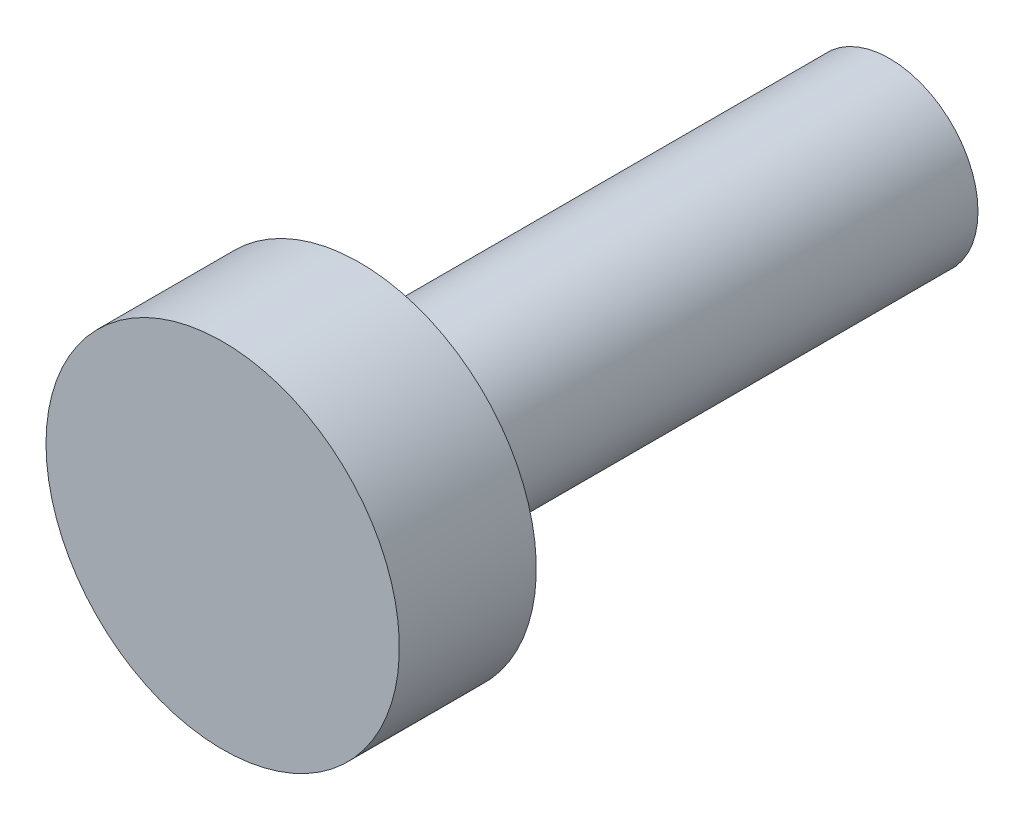
ISO-10303-21;
HEADER;
FILE_DESCRIPTION(('STEP AP214'),'2;1');
FILE_NAME('part.step','',(''),(''),'','','');
FILE_SCHEMA(('AUTOMOTIVE_DESIGN { 1 0 10303 214 1 1 1 1 }'));
ENDSEC;
DATA;
#1=APPLICATION_CONTEXT('core data for automotive mechanical design processes');
#2=APPLICATION_PROTOCOL_DEFINITION('international standard','automotive_design',2000,#1);
#3=PRODUCT_CONTEXT('',#1,'mechanical');
#4=PRODUCT('Part','Part','',(#3));
#5=PRODUCT_RELATED_PRODUCT_CATEGORY('part','',(#4));
#6=PRODUCT_DEFINITION_FORMATION('','',#4);
#7=PRODUCT_DEFINITION_CONTEXT('part definition',#1,'design');
#8=PRODUCT_DEFINITION('design','',#6,#7);
#9=PRODUCT_DEFINITION_SHAPE('','',#8);
#10=(LENGTH_UNIT() NAMED_UNIT(*) SI_UNIT(.MILLI.,.METRE.));
#11=(NAMED_UNIT(*) PLANE_ANGLE_UNIT() SI_UNIT($,.RADIAN.));
#12=(NAMED_UNIT(*) SI_UNIT($,.STERADIAN.) SOLID_ANGLE_UNIT());
#13=UNCERTAINTY_MEASURE_WITH_UNIT(LENGTH_MEASURE(1.E-05),#10,'distance_accuracy_value','');
#14=(GEOMETRIC_REPRESENTATION_CONTEXT(3) GLOBAL_UNCERTAINTY_ASSIGNED_CONTEXT((#13)) GLOBAL_UNIT_ASSIGNED_CONTEXT((#10,
#11,#12)) REPRESENTATION_CONTEXT('',''));
#15=CARTESIAN_POINT('',(0.,0.,0.));
#16=DIRECTION('',(0.,0.,1.));
#17=DIRECTION('',(1.,0.,0.));
#18=AXIS2_PLACEMENT_3D('',#15,#16,#17);
#19=CARTESIAN_POINT('',(0.,0.,3.1));
#20=DIRECTION('',(0.,0.,-1.));
#21=DIRECTION('',(-1.,0.,0.));
#22=AXIS2_PLACEMENT_3D('',#19,#20,#21);
#23=CYLINDRICAL_SURFACE('',#22,4.);
#24=CARTESIAN_POINT('',(0.,0.,3.1));
#25=DIRECTION('',(0.,0.,1.));
#26=DIRECTION('',(1.,0.,0.));
#27=AXIS2_PLACEMENT_3D('',#24,#25,#26);
#28=CIRCLE('',#27,4.);
#29=CARTESIAN_POINT('',(-4.,0.,3.1));
#30=VERTEX_POINT('',#29);
#31=EDGE_CURVE('E37',#30,#30,#28,.T.);
#32=CARTESIAN_POINT('',(0.,0.,0.));
#33=DIRECTION('',(0.,0.,1.));
#34=DIRECTION('',(1.,0.,0.));
#35=AXIS2_PLACEMENT_3D('',#32,#33,#34);
#36=CIRCLE('',#35,4.);
#37=CARTESIAN_POINT('',(-4.,0.,0.));
#38=VERTEX_POINT('',#37);
#39=EDGE_CURVE('E33',#38,#38,#36,.T.);
#40=CARTESIAN_POINT('',(-4.,0.,3.1));
#41=CARTESIAN_POINT('',(-4.,0.,3.06770833333333));
#42=CARTESIAN_POINT('',(-4.,0.,3.03541666666667));
#43=CARTESIAN_POINT('',(-4.,0.,2.97083333333333));
#44=CARTESIAN_POINT('',(-4.,0.,2.93854166666667));
#45=CARTESIAN_POINT('',(-4.,0.,2.87395833333333));
#46=CARTESIAN_POINT('',(-4.,0.,2.84166666666667));
#47=CARTESIAN_POINT('',(-4.,0.,2.77708333333333));
#48=CARTESIAN_POINT('',(-4.,0.,2.74479166666667));
#49=CARTESIAN_POINT('',(-4.,0.,2.68020833333333));
#50=CARTESIAN_POINT('',(-4.,0.,2.64791666666667));
#51=CARTESIAN_POINT('',(-4.,0.,2.58333333333333));
#52=CARTESIAN_POINT('',(-4.,0.,2.55104166666667));
#53=CARTESIAN_POINT('',(-4.,0.,2.48645833333333));
#54=CARTESIAN_POINT('',(-4.,0.,2.45416666666667));
#55=CARTESIAN_POINT('',(-4.,0.,2.38958333333333));
#56=CARTESIAN_POINT('',(-4.,0.,2.35729166666667));
#57=CARTESIAN_POINT('',(-4.,0.,2.29270833333333));
#58=CARTESIAN_POINT('',(-4.,0.,2.26041666666667));
#59=CARTESIAN_POINT('',(-4.,0.,2.19583333333333));
#60=CARTESIAN_POINT('',(-4.,0.,2.16354166666667));
#61=CARTESIAN_POINT('',(-4.,0.,2.09895833333333));
#62=CARTESIAN_POINT('',(-4.,0.,2.06666666666667));
#63=CARTESIAN_POINT('',(-4.,0.,2.00208333333333));
#64=CARTESIAN_POINT('',(-4.,0.,1.96979166666667));
#65=CARTESIAN_POINT('',(-4.,0.,1.90520833333333));
#66=CARTESIAN_POINT('',(-4.,0.,1.87291666666667));
#67=CARTESIAN_POINT('',(-4.,0.,1.80833333333333));
#68=CARTESIAN_POINT('',(-4.,0.,1.77604166666667));
#69=CARTESIAN_POINT('',(-4.,0.,1.71145833333333));
#70=CARTESIAN_POINT('',(-4.,0.,1.67916666666667));
#71=CARTESIAN_POINT('',(-4.,0.,1.61458333333333));
#72=CARTESIAN_POINT('',(-4.,0.,1.58229166666667));
#73=CARTESIAN_POINT('',(-4.,0.,1.51770833333333));
#74=CARTESIAN_POINT('',(-4.,0.,1.48541666666667));
#75=CARTESIAN_POINT('',(-4.,0.,1.42083333333333));
#76=CARTESIAN_POINT('',(-4.,0.,1.38854166666667));
#77=CARTESIAN_POINT('',(-4.,0.,1.32395833333333));
#78=CARTESIAN_POINT('',(-4.,0.,1.29166666666667));
#79=CARTESIAN_POINT('',(-4.,0.,1.22708333333333));
#80=CARTESIAN_POINT('',(-4.,0.,1.19479166666667));
#81=CARTESIAN_POINT('',(-4.,0.,1.13020833333333));
#82=CARTESIAN_POINT('',(-4.,0.,1.09791666666667));
#83=CARTESIAN_POINT('',(-4.,0.,1.03333333333333));
#84=CARTESIAN_POINT('',(-4.,0.,1.00104166666667));
#85=CARTESIAN_POINT('',(-4.,0.,0.936458333333333));
#86=CARTESIAN_POINT('',(-4.,0.,0.904166666666667));
#87=CARTESIAN_POINT('',(-4.,0.,0.839583333333333));
#88=CARTESIAN_POINT('',(-4.,0.,0.807291666666667));
#89=CARTESIAN_POINT('',(-4.,0.,0.742708333333333));
#90=CARTESIAN_POINT('',(-4.,0.,0.710416666666667));
#91=CARTESIAN_POINT('',(-4.,0.,0.645833333333333));
#92=CARTESIAN_POINT('',(-4.,0.,0.613541666666667));
#93=CARTESIAN_POINT('',(-4.,0.,0.548958333333333));
#94=CARTESIAN_POINT('',(-4.,0.,0.516666666666667));
#95=CARTESIAN_POINT('',(-4.,0.,0.452083333333333));
#96=CARTESIAN_POINT('',(-4.,0.,0.419791666666667));
#97=CARTESIAN_POINT('',(-4.,0.,0.355208333333333));
#98=CARTESIAN_POINT('',(-4.,0.,0.322916666666667));
#99=CARTESIAN_POINT('',(-4.,0.,0.258333333333333));
#100=CARTESIAN_POINT('',(-4.,0.,0.226041666666667));
#101=CARTESIAN_POINT('',(-4.,0.,0.161458333333333));
#102=CARTESIAN_POINT('',(-4.,0.,0.129166666666667));
#103=CARTESIAN_POINT('',(-4.,0.,0.0645833333333335));
#104=CARTESIAN_POINT('',(-4.,0.,0.0322916666666667));
#105=CARTESIAN_POINT('',(-4.,0.,0.));
#106=B_SPLINE_CURVE_WITH_KNOTS('',3,(#40,#41,#42,#43,#44,#45,#46,#47,#48,#49,#50,#51,#52,#53,
#54,#55,#56,#57,#58,#59,#60,#61,#62,#63,#64,#65,#66,#67,#68,#69,#70,#71,#72,#73,#74,#75,#76,#77,
#78,#79,#80,#81,#82,#83,#84,#85,#86,#87,#88,#89,#90,#91,#92,#93,#94,#95,#96,#97,#98,#99,#100,
#101,#102,#103,#104,#105),.UNSPECIFIED.,.F.,.F.,(4,2,2,2,2,2,2,2,2,2,2,2,2,2,2,2,2,2,2,2,2,2,2,
2,2,2,2,2,2,2,2,2,4),(0.,0.0968749999999997,0.19375,0.290625,0.3875,0.484375,0.58125,0.678125,
0.775,0.871874999999999,0.96875,1.065625,1.1625,1.259375,1.35625,1.453125,1.55,1.646875,1.74375,
1.840625,1.9375,2.034375,2.13125,2.228125,2.325,2.421875,2.51875,2.615625,2.7125,2.809375,
2.90625,3.003125,3.1),.UNSPECIFIED.);
#107=EDGE_CURVE('BSEAM30',#30,#38,#106,.T.);
#108=ORIENTED_EDGE('',*,*,#31,.F.);
#109=ORIENTED_EDGE('',*,*,#39,.T.);
#110=ORIENTED_EDGE('',*,*,#107,.T.);
#111=ORIENTED_EDGE('',*,*,#107,.F.);
#112=EDGE_LOOP('',(#108,#110,#109,#111));
#113=FACE_BOUND('',#112,.T.);
#114=ADVANCED_FACE('F30',(#113),#23,.T.);
#115=CARTESIAN_POINT('',(0.,0.,3.1));
#116=DIRECTION('',(0.,0.,1.));
#117=DIRECTION('',(1.,0.,0.));
#118=AXIS2_PLACEMENT_3D('',#115,#116,#117);
#119=PLANE('',#118);
#120=ORIENTED_EDGE('',*,*,#31,.T.);
#121=EDGE_LOOP('',(#120));
#122=FACE_BOUND('',#121,.T.);
#123=ADVANCED_FACE('F54',(#122),#119,.T.);
#124=CARTESIAN_POINT('',(0.,0.,0.));
#125=DIRECTION('',(0.,0.,1.));
#126=DIRECTION('',(1.,0.,0.));
#127=AXIS2_PLACEMENT_3D('',#124,#125,#126);
#128=PLANE('',#127);
#129=CARTESIAN_POINT('',(0.,0.,0.));
#130=DIRECTION('',(0.,0.,-1.));
#131=DIRECTION('',(-1.,0.,0.));
#132=AXIS2_PLACEMENT_3D('',#129,#130,#131);
#133=CIRCLE('',#132,2.);
#134=CARTESIAN_POINT('',(-2.,0.,0.));
#135=VERTEX_POINT('',#134);
#136=EDGE_CURVE('E10',#135,#135,#133,.T.);
#137=ORIENTED_EDGE('',*,*,#136,.F.);
#138=EDGE_LOOP('',(#137));
#139=FACE_BOUND('',#138,.T.);
#140=ORIENTED_EDGE('',*,*,#39,.F.);
#141=EDGE_LOOP('',(#140));
#142=FACE_BOUND('',#141,.T.);
#143=ADVANCED_FACE('F51',(#139,#142),#128,.F.);
#144=CARTESIAN_POINT('',(0.,0.,-12.));
#145=DIRECTION('',(0.,0.,1.));
#146=DIRECTION('',(1.,0.,0.));
#147=AXIS2_PLACEMENT_3D('',#144,#145,#146);
#148=CYLINDRICAL_SURFACE('',#147,2.);
#149=CARTESIAN_POINT('',(0.,0.,-12.));
#150=DIRECTION('',(0.,0.,-1.));
#151=DIRECTION('',(-1.,0.,0.));
#152=AXIS2_PLACEMENT_3D('',#149,#150,#151);
#153=CIRCLE('',#152,2.);
#154=CARTESIAN_POINT('',(-2.,0.,-12.));
#155=VERTEX_POINT('',#154);
#156=EDGE_CURVE('E43',#155,#155,#153,.T.);
#157=ORIENTED_EDGE('',*,*,#156,.F.);
#158=EDGE_LOOP('',(#157));
#159=FACE_BOUND('',#158,.T.);
#160=ORIENTED_EDGE('',*,*,#136,.T.);
#161=EDGE_LOOP('',(#160));
#162=FACE_BOUND('',#161,.T.);
#163=ADVANCED_FACE('F53',(#159,#162),#148,.T.);
#164=CARTESIAN_POINT('',(0.,0.,-12.));
#165=DIRECTION('',(0.,0.,-1.));
#166=DIRECTION('',(-1.,0.,0.));
#167=AXIS2_PLACEMENT_3D('',#164,#165,#166);
#168=PLANE('',#167);
#169=ORIENTED_EDGE('',*,*,#156,.T.);
#170=EDGE_LOOP('',(#169));
#171=FACE_BOUND('',#170,.T.);
#172=ADVANCED_FACE('F60',(#171),#168,.T.);
#173=CLOSED_SHELL('',(#114,#123,#143,#163,#172));
#174=MANIFOLD_SOLID_BREP('B2',#173);
#175=ADVANCED_BREP_SHAPE_REPRESENTATION('',(#18,#174),#14);
#176=SHAPE_DEFINITION_REPRESENTATION(#9,#175);
ENDSEC;
END-ISO-10303-21;
